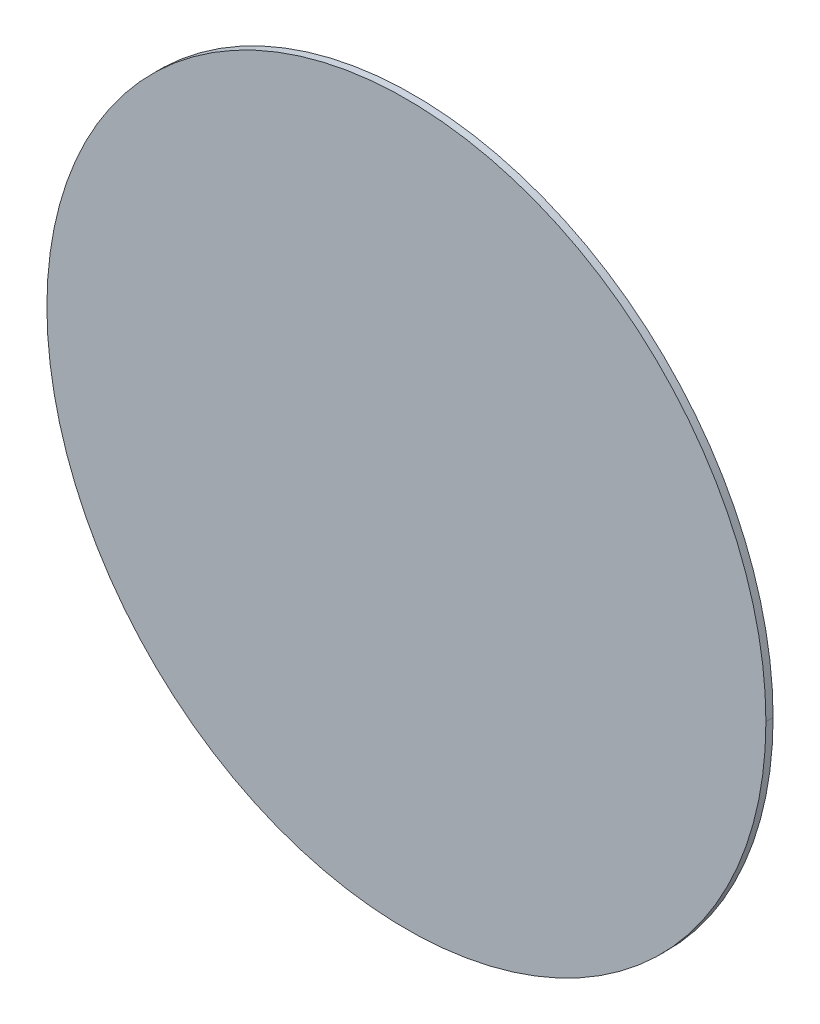
ISO-10303-21;
HEADER;
FILE_DESCRIPTION(('STEP AP214'),'2;1');
FILE_NAME('part.step','',(''),(''),'','','');
FILE_SCHEMA(('AUTOMOTIVE_DESIGN { 1 0 10303 214 1 1 1 1 }'));
ENDSEC;
DATA;
#1=APPLICATION_CONTEXT('core data for automotive mechanical design processes');
#2=APPLICATION_PROTOCOL_DEFINITION('international standard','automotive_design',2000,#1);
#3=PRODUCT_CONTEXT('',#1,'mechanical');
#4=PRODUCT('Part','Part','',(#3));
#5=PRODUCT_RELATED_PRODUCT_CATEGORY('part','',(#4));
#6=PRODUCT_DEFINITION_FORMATION('','',#4);
#7=PRODUCT_DEFINITION_CONTEXT('part definition',#1,'design');
#8=PRODUCT_DEFINITION('design','',#6,#7);
#9=PRODUCT_DEFINITION_SHAPE('','',#8);
#10=(LENGTH_UNIT() NAMED_UNIT(*) SI_UNIT(.MILLI.,.METRE.));
#11=(NAMED_UNIT(*) PLANE_ANGLE_UNIT() SI_UNIT($,.RADIAN.));
#12=(NAMED_UNIT(*) SI_UNIT($,.STERADIAN.) SOLID_ANGLE_UNIT());
#13=UNCERTAINTY_MEASURE_WITH_UNIT(LENGTH_MEASURE(1.E-05),#10,'distance_accuracy_value','');
#14=(GEOMETRIC_REPRESENTATION_CONTEXT(3) GLOBAL_UNCERTAINTY_ASSIGNED_CONTEXT((#13)) GLOBAL_UNIT_ASSIGNED_CONTEXT((#10,
#11,#12)) REPRESENTATION_CONTEXT('',''));
#15=CARTESIAN_POINT('',(0.,0.,0.));
#16=DIRECTION('',(0.,0.,1.));
#17=DIRECTION('',(1.,0.,0.));
#18=AXIS2_PLACEMENT_3D('',#15,#16,#17);
#19=CARTESIAN_POINT('',(0.,0.,0.));
#20=DIRECTION('',(0.,0.,1.));
#21=DIRECTION('',(1.,0.,0.));
#22=AXIS2_PLACEMENT_3D('',#19,#20,#21);
#23=PLANE('',#22);
#24=CARTESIAN_POINT('',(0.,0.,0.));
#25=DIRECTION('',(0.,0.,1.));
#26=DIRECTION('',(1.,0.,0.));
#27=AXIS2_PLACEMENT_3D('',#24,#25,#26);
#28=CIRCLE('',#27,5.);
#29=CARTESIAN_POINT('',(-5.,0.,0.));
#30=VERTEX_POINT('',#29);
#31=CARTESIAN_POINT('',(5.,0.,0.));
#32=VERTEX_POINT('',#31);
#33=EDGE_CURVE('E11',#30,#32,#28,.T.);
#34=ORIENTED_EDGE('',*,*,#33,.F.);
#35=CARTESIAN_POINT('',(0.,0.,0.));
#36=DIRECTION('',(0.,0.,1.));
#37=DIRECTION('',(1.,0.,0.));
#38=AXIS2_PLACEMENT_3D('',#35,#36,#37);
#39=CIRCLE('',#38,5.);
#40=EDGE_CURVE('E67',#32,#30,#39,.T.);
#41=ORIENTED_EDGE('',*,*,#40,.F.);
#42=EDGE_LOOP('',(#34,#41));
#43=FACE_BOUND('',#42,.T.);
#44=ADVANCED_FACE('F17',(#43),#23,.F.);
#45=CARTESIAN_POINT('',(0.,0.,0.1));
#46=DIRECTION('',(0.,0.,1.));
#47=DIRECTION('',(1.,0.,0.));
#48=AXIS2_PLACEMENT_3D('',#45,#46,#47);
#49=PLANE('',#48);
#50=CARTESIAN_POINT('',(0.,0.,0.1));
#51=DIRECTION('',(0.,0.,1.));
#52=DIRECTION('',(1.,0.,0.));
#53=AXIS2_PLACEMENT_3D('',#50,#51,#52);
#54=CIRCLE('',#53,5.);
#55=CARTESIAN_POINT('',(-5.,0.,0.1));
#56=VERTEX_POINT('',#55);
#57=CARTESIAN_POINT('',(5.,0.,0.1));
#58=VERTEX_POINT('',#57);
#59=EDGE_CURVE('E21',#56,#58,#54,.T.);
#60=ORIENTED_EDGE('',*,*,#59,.T.);
#61=CARTESIAN_POINT('',(0.,0.,0.1));
#62=DIRECTION('',(0.,0.,1.));
#63=DIRECTION('',(1.,0.,0.));
#64=AXIS2_PLACEMENT_3D('',#61,#62,#63);
#65=CIRCLE('',#64,5.);
#66=EDGE_CURVE('E57',#58,#56,#65,.T.);
#67=ORIENTED_EDGE('',*,*,#66,.T.);
#68=EDGE_LOOP('',(#60,#67));
#69=FACE_BOUND('',#68,.T.);
#70=ADVANCED_FACE('F19',(#69),#49,.T.);
#71=CARTESIAN_POINT('',(0.,0.,0.1));
#72=DIRECTION('',(0.,0.,-1.));
#73=DIRECTION('',(-1.,0.,0.));
#74=AXIS2_PLACEMENT_3D('',#71,#72,#73);
#75=CYLINDRICAL_SURFACE('',#74,5.);
#76=DIRECTION('',(0.,0.,-1.));
#77=VECTOR('',#76,1.);
#78=CARTESIAN_POINT('',(5.,0.,0.1));
#79=LINE('',#78,#77);
#80=EDGE_CURVE('E62',#58,#32,#79,.T.);
#81=ORIENTED_EDGE('',*,*,#80,.F.);
#82=ORIENTED_EDGE('',*,*,#59,.F.);
#83=DIRECTION('',(0.,0.,-1.));
#84=VECTOR('',#83,1.);
#85=CARTESIAN_POINT('',(-5.,0.,0.1));
#86=LINE('',#85,#84);
#87=EDGE_CURVE('E60',#56,#30,#86,.T.);
#88=ORIENTED_EDGE('',*,*,#87,.T.);
#89=ORIENTED_EDGE('',*,*,#33,.T.);
#90=EDGE_LOOP('',(#81,#82,#88,#89));
#91=FACE_BOUND('',#90,.T.);
#92=ADVANCED_FACE('F63',(#91),#75,.T.);
#93=CARTESIAN_POINT('',(0.,0.,0.1));
#94=DIRECTION('',(0.,0.,-1.));
#95=DIRECTION('',(-1.,0.,0.));
#96=AXIS2_PLACEMENT_3D('',#93,#94,#95);
#97=CYLINDRICAL_SURFACE('',#96,5.);
#98=ORIENTED_EDGE('',*,*,#66,.F.);
#99=ORIENTED_EDGE('',*,*,#80,.T.);
#100=ORIENTED_EDGE('',*,*,#40,.T.);
#101=ORIENTED_EDGE('',*,*,#87,.F.);
#102=EDGE_LOOP('',(#98,#99,#100,#101));
#103=FACE_BOUND('',#102,.T.);
#104=ADVANCED_FACE('F69',(#103),#97,.T.);
#105=CLOSED_SHELL('',(#44,#70,#92,#104));
#106=MANIFOLD_SOLID_BREP('B1',#105);
#107=ADVANCED_BREP_SHAPE_REPRESENTATION('',(#18,#106),#14);
#108=SHAPE_DEFINITION_REPRESENTATION(#9,#107);
ENDSEC;
END-ISO-10303-21;
